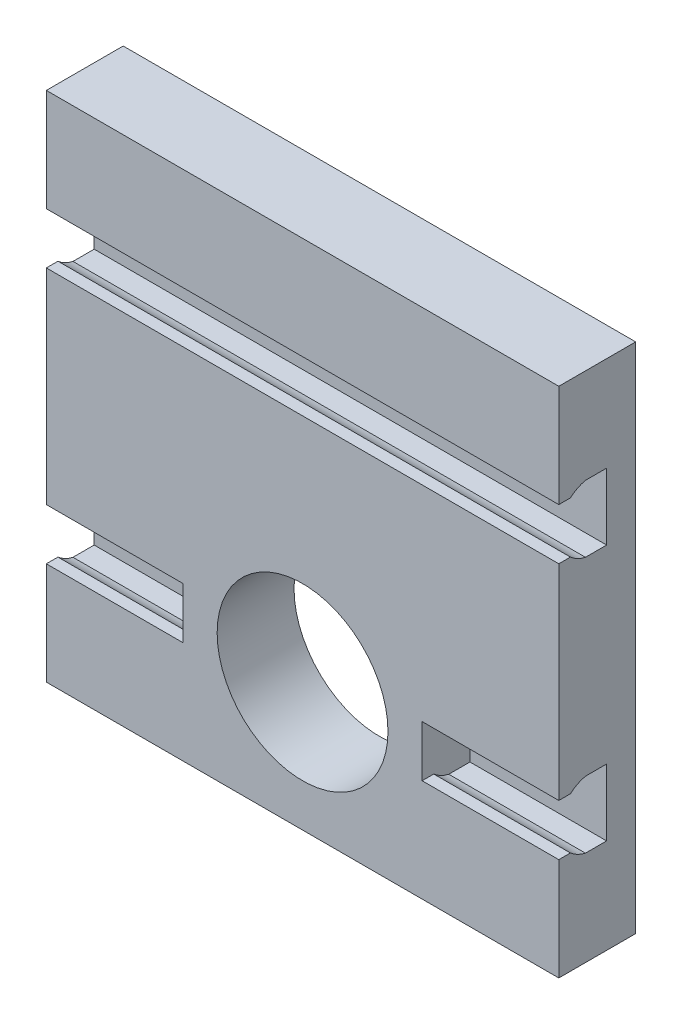
ISO-10303-21;
HEADER;
FILE_DESCRIPTION(('STEP AP214'),'2;1');
FILE_NAME('part.step','',(''),(''),'','','');
FILE_SCHEMA(('AUTOMOTIVE_DESIGN { 1 0 10303 214 1 1 1 1 }'));
ENDSEC;
DATA;
#1=APPLICATION_CONTEXT('core data for automotive mechanical design processes');
#2=APPLICATION_PROTOCOL_DEFINITION('international standard','automotive_design',2000,#1);
#3=PRODUCT_CONTEXT('',#1,'mechanical');
#4=PRODUCT('Part','Part','',(#3));
#5=PRODUCT_RELATED_PRODUCT_CATEGORY('part','',(#4));
#6=PRODUCT_DEFINITION_FORMATION('','',#4);
#7=PRODUCT_DEFINITION_CONTEXT('part definition',#1,'design');
#8=PRODUCT_DEFINITION('design','',#6,#7);
#9=PRODUCT_DEFINITION_SHAPE('','',#8);
#10=(LENGTH_UNIT() NAMED_UNIT(*) SI_UNIT(.MILLI.,.METRE.));
#11=(NAMED_UNIT(*) PLANE_ANGLE_UNIT() SI_UNIT($,.RADIAN.));
#12=(NAMED_UNIT(*) SI_UNIT($,.STERADIAN.) SOLID_ANGLE_UNIT());
#13=UNCERTAINTY_MEASURE_WITH_UNIT(LENGTH_MEASURE(1.E-05),#10,'distance_accuracy_value','');
#14=(GEOMETRIC_REPRESENTATION_CONTEXT(3) GLOBAL_UNCERTAINTY_ASSIGNED_CONTEXT((#13)) GLOBAL_UNIT_ASSIGNED_CONTEXT((#10,
#11,#12)) REPRESENTATION_CONTEXT('',''));
#15=CARTESIAN_POINT('',(0.,0.,0.));
#16=DIRECTION('',(0.,0.,1.));
#17=DIRECTION('',(1.,0.,0.));
#18=AXIS2_PLACEMENT_3D('',#15,#16,#17);
#19=CARTESIAN_POINT('',(0.,0.,4.5));
#20=DIRECTION('',(0.,0.,-1.));
#21=DIRECTION('',(-1.,0.,0.));
#22=AXIS2_PLACEMENT_3D('',#19,#20,#21);
#23=PLANE('',#22);
#24=CARTESIAN_POINT('',(0.,-6.,4.5));
#25=DIRECTION('',(0.,0.,1.));
#26=DIRECTION('',(1.,0.,0.));
#27=AXIS2_PLACEMENT_3D('',#24,#25,#26);
#28=CIRCLE('',#27,5.);
#29=CARTESIAN_POINT('',(5.,-6.,4.5));
#30=VERTEX_POINT('',#29);
#31=EDGE_CURVE('E405',#30,#30,#28,.T.);
#32=ORIENTED_EDGE('',*,*,#31,.F.);
#33=EDGE_LOOP('',(#32));
#34=FACE_BOUND('',#33,.T.);
#35=DIRECTION('',(-1.,0.,0.));
#36=VECTOR('',#35,1.);
#37=CARTESIAN_POINT('',(-7.,-4.5,4.5));
#38=LINE('',#37,#36);
#39=CARTESIAN_POINT('',(-7.,-4.5,4.5));
#40=VERTEX_POINT('',#39);
#41=CARTESIAN_POINT('',(-15.,-4.5,4.5));
#42=VERTEX_POINT('',#41);
#43=EDGE_CURVE('E274',#40,#42,#38,.T.);
#44=ORIENTED_EDGE('',*,*,#43,.F.);
#45=DIRECTION('',(0.,-1.,0.));
#46=VECTOR('',#45,1.);
#47=CARTESIAN_POINT('',(-7.,-7.5,4.5));
#48=LINE('',#47,#46);
#49=CARTESIAN_POINT('',(-7.,-7.5,4.5));
#50=VERTEX_POINT('',#49);
#51=EDGE_CURVE('E254',#40,#50,#48,.T.);
#52=ORIENTED_EDGE('',*,*,#51,.T.);
#53=DIRECTION('',(-1.,0.,0.));
#54=VECTOR('',#53,1.);
#55=CARTESIAN_POINT('',(-7.,-7.5,4.5));
#56=LINE('',#55,#54);
#57=CARTESIAN_POINT('',(-15.,-7.5,4.5));
#58=VERTEX_POINT('',#57);
#59=EDGE_CURVE('E276',#50,#58,#56,.T.);
#60=ORIENTED_EDGE('',*,*,#59,.T.);
#61=DIRECTION('',(0.,-1.,0.));
#62=VECTOR('',#61,1.);
#63=CARTESIAN_POINT('',(-15.,-13.5,4.5));
#64=LINE('',#63,#62);
#65=CARTESIAN_POINT('',(-15.,-13.5,4.5));
#66=VERTEX_POINT('',#65);
#67=EDGE_CURVE('E418',#58,#66,#64,.T.);
#68=ORIENTED_EDGE('',*,*,#67,.T.);
#69=DIRECTION('',(1.,0.,0.));
#70=VECTOR('',#69,1.);
#71=CARTESIAN_POINT('',(-15.,-13.5,4.5));
#72=LINE('',#71,#70);
#73=CARTESIAN_POINT('',(15.,-13.5,4.5));
#74=VERTEX_POINT('',#73);
#75=EDGE_CURVE('E422',#66,#74,#72,.T.);
#76=ORIENTED_EDGE('',*,*,#75,.T.);
#77=DIRECTION('',(0.,1.,0.));
#78=VECTOR('',#77,1.);
#79=CARTESIAN_POINT('',(15.,-13.5,4.5));
#80=LINE('',#79,#78);
#81=CARTESIAN_POINT('',(15.,-7.5,4.5));
#82=VERTEX_POINT('',#81);
#83=EDGE_CURVE('E411',#74,#82,#80,.T.);
#84=ORIENTED_EDGE('',*,*,#83,.T.);
#85=DIRECTION('',(1.,0.,0.));
#86=VECTOR('',#85,1.);
#87=CARTESIAN_POINT('',(7.,-7.5,4.5));
#88=LINE('',#87,#86);
#89=CARTESIAN_POINT('',(7.,-7.5,4.5));
#90=VERTEX_POINT('',#89);
#91=EDGE_CURVE('E340',#90,#82,#88,.T.);
#92=ORIENTED_EDGE('',*,*,#91,.F.);
#93=DIRECTION('',(0.,-1.,0.));
#94=VECTOR('',#93,1.);
#95=CARTESIAN_POINT('',(7.,-7.5,4.5));
#96=LINE('',#95,#94);
#97=CARTESIAN_POINT('',(7.,-4.5,4.5));
#98=VERTEX_POINT('',#97);
#99=EDGE_CURVE('E293',#98,#90,#96,.T.);
#100=ORIENTED_EDGE('',*,*,#99,.F.);
#101=DIRECTION('',(1.,0.,0.));
#102=VECTOR('',#101,1.);
#103=CARTESIAN_POINT('',(7.,-4.5,4.5));
#104=LINE('',#103,#102);
#105=CARTESIAN_POINT('',(15.,-4.5,4.5));
#106=VERTEX_POINT('',#105);
#107=EDGE_CURVE('E342',#98,#106,#104,.T.);
#108=ORIENTED_EDGE('',*,*,#107,.T.);
#109=CARTESIAN_POINT('',(15.,7.5,4.5));
#110=VERTEX_POINT('',#109);
#111=EDGE_CURVE('E415',#106,#110,#80,.T.);
#112=ORIENTED_EDGE('',*,*,#111,.T.);
#113=DIRECTION('',(1.,0.,0.));
#114=VECTOR('',#113,1.);
#115=CARTESIAN_POINT('',(-15.,7.49999999999999,4.5));
#116=LINE('',#115,#114);
#117=CARTESIAN_POINT('',(-15.,7.49999999999999,4.5));
#118=VERTEX_POINT('',#117);
#119=EDGE_CURVE('E368',#118,#110,#116,.T.);
#120=ORIENTED_EDGE('',*,*,#119,.F.);
#121=EDGE_CURVE('E423',#118,#42,#64,.T.);
#122=ORIENTED_EDGE('',*,*,#121,.T.);
#123=EDGE_LOOP('',(#44,#52,#60,#68,#76,#84,#92,#100,#108,#112,#120,#122));
#124=FACE_BOUND('',#123,.T.);
#125=ADVANCED_FACE('F35',(#34,#124),#23,.F.);
#126=CARTESIAN_POINT('',(-15.,-13.5,4.5));
#127=DIRECTION('',(1.,0.,0.));
#128=DIRECTION('',(0.,1.,0.));
#129=AXIS2_PLACEMENT_3D('',#126,#127,#128);
#130=PLANE('',#129);
#131=DIRECTION('',(0.,0.,1.));
#132=VECTOR('',#131,1.);
#133=CARTESIAN_POINT('',(-15.,-4.5,4.5));
#134=LINE('',#133,#132);
#135=CARTESIAN_POINT('',(-15.,-4.5,3.82));
#136=VERTEX_POINT('',#135);
#137=EDGE_CURVE('E241',#136,#42,#134,.T.);
#138=ORIENTED_EDGE('',*,*,#137,.T.);
#139=ORIENTED_EDGE('',*,*,#121,.F.);
#140=DIRECTION('',(0.,0.,-1.));
#141=VECTOR('',#140,1.);
#142=CARTESIAN_POINT('',(-15.,7.49999999999999,4.5));
#143=LINE('',#142,#141);
#144=CARTESIAN_POINT('',(-15.,7.49999999999999,3.82));
#145=VERTEX_POINT('',#144);
#146=EDGE_CURVE('E346',#118,#145,#143,.T.);
#147=ORIENTED_EDGE('',*,*,#146,.T.);
#148=CARTESIAN_POINT('',(-15.,8.99999999999999,2.4971243444677));
#149=DIRECTION('',(1.,0.,0.));
#150=DIRECTION('',(0.,1.,0.));
#151=AXIS2_PLACEMENT_3D('',#148,#149,#150);
#152=CIRCLE('',#151,2.);
#153=CARTESIAN_POINT('',(-15.,7.04999999999999,2.94153406533349));
#154=VERTEX_POINT('',#153);
#155=EDGE_CURVE('E349',#145,#154,#152,.T.);
#156=ORIENTED_EDGE('',*,*,#155,.T.);
#157=DIRECTION('',(0.,0.,-1.));
#158=VECTOR('',#157,1.);
#159=CARTESIAN_POINT('',(-15.,7.05,2.94153406533349));
#160=LINE('',#159,#158);
#161=CARTESIAN_POINT('',(-15.,7.05,1.7));
#162=VERTEX_POINT('',#161);
#163=EDGE_CURVE('E353',#154,#162,#160,.T.);
#164=ORIENTED_EDGE('',*,*,#163,.T.);
#165=DIRECTION('',(0.,1.,0.));
#166=VECTOR('',#165,1.);
#167=CARTESIAN_POINT('',(-15.,10.95,1.7));
#168=LINE('',#167,#166);
#169=CARTESIAN_POINT('',(-15.,10.95,1.7));
#170=VERTEX_POINT('',#169);
#171=EDGE_CURVE('E356',#162,#170,#168,.T.);
#172=ORIENTED_EDGE('',*,*,#171,.T.);
#173=DIRECTION('',(0.,0.,1.));
#174=VECTOR('',#173,1.);
#175=CARTESIAN_POINT('',(-15.,10.95,2.94153406533349));
#176=LINE('',#175,#174);
#177=CARTESIAN_POINT('',(-15.,10.95,2.94153406533349));
#178=VERTEX_POINT('',#177);
#179=EDGE_CURVE('E359',#170,#178,#176,.T.);
#180=ORIENTED_EDGE('',*,*,#179,.T.);
#181=CARTESIAN_POINT('',(-15.,8.99999999999999,2.4971243444677));
#182=DIRECTION('',(1.,0.,0.));
#183=DIRECTION('',(0.,1.,0.));
#184=AXIS2_PLACEMENT_3D('',#181,#182,#183);
#185=CIRCLE('',#184,2.);
#186=CARTESIAN_POINT('',(-15.,10.5,3.82));
#187=VERTEX_POINT('',#186);
#188=EDGE_CURVE('E362',#178,#187,#185,.T.);
#189=ORIENTED_EDGE('',*,*,#188,.T.);
#190=DIRECTION('',(0.,0.,1.));
#191=VECTOR('',#190,1.);
#192=CARTESIAN_POINT('',(-15.,10.5,4.5));
#193=LINE('',#192,#191);
#194=CARTESIAN_POINT('',(-15.,10.5,4.5));
#195=VERTEX_POINT('',#194);
#196=EDGE_CURVE('E365',#187,#195,#193,.T.);
#197=ORIENTED_EDGE('',*,*,#196,.T.);
#198=CARTESIAN_POINT('',(-15.,16.5,4.5));
#199=VERTEX_POINT('',#198);
#200=EDGE_CURVE('E419',#199,#195,#64,.T.);
#201=ORIENTED_EDGE('',*,*,#200,.F.);
#202=DIRECTION('',(0.,0.,-1.));
#203=VECTOR('',#202,1.);
#204=CARTESIAN_POINT('',(-15.,16.5,4.5));
#205=LINE('',#204,#203);
#206=CARTESIAN_POINT('',(-15.,16.5,0.));
#207=VERTEX_POINT('',#206);
#208=EDGE_CURVE('E43',#199,#207,#205,.T.);
#209=ORIENTED_EDGE('',*,*,#208,.T.);
#210=DIRECTION('',(0.,-1.,0.));
#211=VECTOR('',#210,1.);
#212=CARTESIAN_POINT('',(-15.,-13.5,0.));
#213=LINE('',#212,#211);
#214=CARTESIAN_POINT('',(-15.,-13.5,0.));
#215=VERTEX_POINT('',#214);
#216=EDGE_CURVE('E430',#207,#215,#213,.T.);
#217=ORIENTED_EDGE('',*,*,#216,.T.);
#218=DIRECTION('',(0.,0.,-1.));
#219=VECTOR('',#218,1.);
#220=CARTESIAN_POINT('',(-15.,-13.5,4.5));
#221=LINE('',#220,#219);
#222=EDGE_CURVE('E436',#66,#215,#221,.T.);
#223=ORIENTED_EDGE('',*,*,#222,.F.);
#224=ORIENTED_EDGE('',*,*,#67,.F.);
#225=DIRECTION('',(0.,0.,-1.));
#226=VECTOR('',#225,1.);
#227=CARTESIAN_POINT('',(-15.,-7.5,3.82));
#228=LINE('',#227,#226);
#229=CARTESIAN_POINT('',(-15.,-7.5,3.82));
#230=VERTEX_POINT('',#229);
#231=EDGE_CURVE('E244',#58,#230,#228,.T.);
#232=ORIENTED_EDGE('',*,*,#231,.T.);
#233=CARTESIAN_POINT('',(-15.,-6.,2.4971243444677));
#234=DIRECTION('',(1.,0.,0.));
#235=DIRECTION('',(0.,-1.,0.));
#236=AXIS2_PLACEMENT_3D('',#233,#234,#235);
#237=CIRCLE('',#236,2.);
#238=CARTESIAN_POINT('',(-15.,-7.95,2.94153406533349));
#239=VERTEX_POINT('',#238);
#240=EDGE_CURVE('E267',#230,#239,#237,.T.);
#241=ORIENTED_EDGE('',*,*,#240,.T.);
#242=DIRECTION('',(0.,0.,-1.));
#243=VECTOR('',#242,1.);
#244=CARTESIAN_POINT('',(-15.,-7.95,1.7));
#245=LINE('',#244,#243);
#246=CARTESIAN_POINT('',(-15.,-7.95,1.7));
#247=VERTEX_POINT('',#246);
#248=EDGE_CURVE('E264',#239,#247,#245,.T.);
#249=ORIENTED_EDGE('',*,*,#248,.T.);
#250=DIRECTION('',(0.,1.,0.));
#251=VECTOR('',#250,1.);
#252=CARTESIAN_POINT('',(-15.,-4.05000000000001,1.7));
#253=LINE('',#252,#251);
#254=CARTESIAN_POINT('',(-15.,-4.05000000000001,1.7));
#255=VERTEX_POINT('',#254);
#256=EDGE_CURVE('E261',#247,#255,#253,.T.);
#257=ORIENTED_EDGE('',*,*,#256,.T.);
#258=DIRECTION('',(0.,0.,1.));
#259=VECTOR('',#258,1.);
#260=CARTESIAN_POINT('',(-15.,-4.05,2.94153406533349));
#261=LINE('',#260,#259);
#262=CARTESIAN_POINT('',(-15.,-4.05,2.94153406533349));
#263=VERTEX_POINT('',#262);
#264=EDGE_CURVE('E259',#255,#263,#261,.T.);
#265=ORIENTED_EDGE('',*,*,#264,.T.);
#266=CARTESIAN_POINT('',(-15.,-6.,2.4971243444677));
#267=DIRECTION('',(1.,0.,0.));
#268=DIRECTION('',(0.,-1.,0.));
#269=AXIS2_PLACEMENT_3D('',#266,#267,#268);
#270=CIRCLE('',#269,2.);
#271=EDGE_CURVE('E50',#263,#136,#270,.T.);
#272=ORIENTED_EDGE('',*,*,#271,.T.);
#273=EDGE_LOOP('',(#138,#139,#147,#156,#164,#172,#180,#189,#197,#201,#209,#217,#223,#224,#232,
#241,#249,#257,#265,#272));
#274=FACE_BOUND('',#273,.T.);
#275=ADVANCED_FACE('F443',(#274),#130,.F.);
#276=ORIENTED_EDGE('',*,*,#200,.T.);
#277=DIRECTION('',(1.,0.,0.));
#278=VECTOR('',#277,1.);
#279=CARTESIAN_POINT('',(-15.,10.5,4.5));
#280=LINE('',#279,#278);
#281=CARTESIAN_POINT('',(15.,10.5,4.5));
#282=VERTEX_POINT('',#281);
#283=EDGE_CURVE('E387',#195,#282,#280,.T.);
#284=ORIENTED_EDGE('',*,*,#283,.T.);
#285=CARTESIAN_POINT('',(15.,16.5,4.5));
#286=VERTEX_POINT('',#285);
#287=EDGE_CURVE('E416',#282,#286,#80,.T.);
#288=ORIENTED_EDGE('',*,*,#287,.T.);
#289=DIRECTION('',(-1.,0.,0.));
#290=VECTOR('',#289,1.);
#291=CARTESIAN_POINT('',(-15.,16.5,4.5));
#292=LINE('',#291,#290);
#293=EDGE_CURVE('E414',#286,#199,#292,.T.);
#294=ORIENTED_EDGE('',*,*,#293,.T.);
#295=EDGE_LOOP('',(#276,#284,#288,#294));
#296=FACE_BOUND('',#295,.T.);
#297=ADVANCED_FACE('F499',(#296),#23,.F.);
#298=CARTESIAN_POINT('',(0.,0.,0.));
#299=DIRECTION('',(0.,0.,-1.));
#300=DIRECTION('',(-1.,0.,0.));
#301=AXIS2_PLACEMENT_3D('',#298,#299,#300);
#302=PLANE('',#301);
#303=DIRECTION('',(0.,1.,0.));
#304=VECTOR('',#303,1.);
#305=CARTESIAN_POINT('',(15.,-13.5,0.));
#306=LINE('',#305,#304);
#307=CARTESIAN_POINT('',(15.,-13.5,0.));
#308=VERTEX_POINT('',#307);
#309=CARTESIAN_POINT('',(15.,16.5,0.));
#310=VERTEX_POINT('',#309);
#311=EDGE_CURVE('E408',#308,#310,#306,.T.);
#312=ORIENTED_EDGE('',*,*,#311,.F.);
#313=DIRECTION('',(1.,0.,0.));
#314=VECTOR('',#313,1.);
#315=CARTESIAN_POINT('',(-15.,-13.5,0.));
#316=LINE('',#315,#314);
#317=EDGE_CURVE('E432',#215,#308,#316,.T.);
#318=ORIENTED_EDGE('',*,*,#317,.F.);
#319=ORIENTED_EDGE('',*,*,#216,.F.);
#320=DIRECTION('',(-1.,0.,0.));
#321=VECTOR('',#320,1.);
#322=CARTESIAN_POINT('',(-15.,16.5,0.));
#323=LINE('',#322,#321);
#324=EDGE_CURVE('E428',#310,#207,#323,.T.);
#325=ORIENTED_EDGE('',*,*,#324,.F.);
#326=EDGE_LOOP('',(#312,#318,#319,#325));
#327=FACE_BOUND('',#326,.T.);
#328=CARTESIAN_POINT('',(0.,-6.,0.));
#329=DIRECTION('',(0.,0.,1.));
#330=DIRECTION('',(1.,0.,0.));
#331=AXIS2_PLACEMENT_3D('',#328,#329,#330);
#332=CIRCLE('',#331,5.);
#333=CARTESIAN_POINT('',(5.,-6.,0.));
#334=VERTEX_POINT('',#333);
#335=EDGE_CURVE('E390',#334,#334,#332,.T.);
#336=ORIENTED_EDGE('',*,*,#335,.T.);
#337=EDGE_LOOP('',(#336));
#338=FACE_BOUND('',#337,.T.);
#339=ADVANCED_FACE('F450',(#327,#338),#302,.T.);
#340=CARTESIAN_POINT('',(15.,-13.5,4.5));
#341=DIRECTION('',(-1.,0.,0.));
#342=DIRECTION('',(0.,-1.,0.));
#343=AXIS2_PLACEMENT_3D('',#340,#341,#342);
#344=PLANE('',#343);
#345=CARTESIAN_POINT('',(15.,-6.,2.4971243444677));
#346=DIRECTION('',(1.,0.,0.));
#347=DIRECTION('',(0.,-1.,0.));
#348=AXIS2_PLACEMENT_3D('',#345,#346,#347);
#349=CIRCLE('',#348,2.);
#350=CARTESIAN_POINT('',(15.,-7.5,3.82));
#351=VERTEX_POINT('',#350);
#352=CARTESIAN_POINT('',(15.,-7.95,2.94153406533349));
#353=VERTEX_POINT('',#352);
#354=EDGE_CURVE('E318',#351,#353,#349,.T.);
#355=ORIENTED_EDGE('',*,*,#354,.F.);
#356=DIRECTION('',(0.,0.,-1.));
#357=VECTOR('',#356,1.);
#358=CARTESIAN_POINT('',(15.,-7.5,3.82));
#359=LINE('',#358,#357);
#360=EDGE_CURVE('E315',#82,#351,#359,.T.);
#361=ORIENTED_EDGE('',*,*,#360,.F.);
#362=ORIENTED_EDGE('',*,*,#83,.F.);
#363=DIRECTION('',(0.,0.,-1.));
#364=VECTOR('',#363,1.);
#365=CARTESIAN_POINT('',(15.,-13.5,4.5));
#366=LINE('',#365,#364);
#367=EDGE_CURVE('E425',#74,#308,#366,.T.);
#368=ORIENTED_EDGE('',*,*,#367,.T.);
#369=ORIENTED_EDGE('',*,*,#311,.T.);
#370=DIRECTION('',(0.,0.,-1.));
#371=VECTOR('',#370,1.);
#372=CARTESIAN_POINT('',(15.,16.5,4.5));
#373=LINE('',#372,#371);
#374=EDGE_CURVE('E11',#286,#310,#373,.T.);
#375=ORIENTED_EDGE('',*,*,#374,.F.);
#376=ORIENTED_EDGE('',*,*,#287,.F.);
#377=DIRECTION('',(0.,0.,1.));
#378=VECTOR('',#377,1.);
#379=CARTESIAN_POINT('',(15.,10.5,4.5));
#380=LINE('',#379,#378);
#381=CARTESIAN_POINT('',(15.,10.5,3.82));
#382=VERTEX_POINT('',#381);
#383=EDGE_CURVE('E350',#382,#282,#380,.T.);
#384=ORIENTED_EDGE('',*,*,#383,.F.);
#385=CARTESIAN_POINT('',(15.,9.,2.4971243444677));
#386=DIRECTION('',(1.,0.,0.));
#387=DIRECTION('',(0.,1.,0.));
#388=AXIS2_PLACEMENT_3D('',#385,#386,#387);
#389=CIRCLE('',#388,2.);
#390=CARTESIAN_POINT('',(15.,10.95,2.94153406533349));
#391=VERTEX_POINT('',#390);
#392=EDGE_CURVE('E383',#391,#382,#389,.T.);
#393=ORIENTED_EDGE('',*,*,#392,.F.);
#394=DIRECTION('',(0.,0.,1.));
#395=VECTOR('',#394,1.);
#396=CARTESIAN_POINT('',(15.,10.95,2.94153406533349));
#397=LINE('',#396,#395);
#398=CARTESIAN_POINT('',(15.,10.95,1.7));
#399=VERTEX_POINT('',#398);
#400=EDGE_CURVE('E380',#399,#391,#397,.T.);
#401=ORIENTED_EDGE('',*,*,#400,.F.);
#402=DIRECTION('',(0.,1.,0.));
#403=VECTOR('',#402,1.);
#404=CARTESIAN_POINT('',(15.,10.95,1.7));
#405=LINE('',#404,#403);
#406=CARTESIAN_POINT('',(15.,7.05,1.7));
#407=VERTEX_POINT('',#406);
#408=EDGE_CURVE('E377',#407,#399,#405,.T.);
#409=ORIENTED_EDGE('',*,*,#408,.F.);
#410=DIRECTION('',(0.,0.,-1.));
#411=VECTOR('',#410,1.);
#412=CARTESIAN_POINT('',(15.,7.05,2.94153406533349));
#413=LINE('',#412,#411);
#414=CARTESIAN_POINT('',(15.,7.05,2.94153406533349));
#415=VERTEX_POINT('',#414);
#416=EDGE_CURVE('E374',#415,#407,#413,.T.);
#417=ORIENTED_EDGE('',*,*,#416,.F.);
#418=CARTESIAN_POINT('',(15.,9.,2.4971243444677));
#419=DIRECTION('',(1.,0.,0.));
#420=DIRECTION('',(0.,1.,0.));
#421=AXIS2_PLACEMENT_3D('',#418,#419,#420);
#422=CIRCLE('',#421,2.);
#423=CARTESIAN_POINT('',(15.,7.5,3.82));
#424=VERTEX_POINT('',#423);
#425=EDGE_CURVE('E371',#424,#415,#422,.T.);
#426=ORIENTED_EDGE('',*,*,#425,.F.);
#427=DIRECTION('',(0.,0.,-1.));
#428=VECTOR('',#427,1.);
#429=CARTESIAN_POINT('',(15.,7.5,4.5));
#430=LINE('',#429,#428);
#431=EDGE_CURVE('E331',#110,#424,#430,.T.);
#432=ORIENTED_EDGE('',*,*,#431,.F.);
#433=ORIENTED_EDGE('',*,*,#111,.F.);
#434=DIRECTION('',(0.,0.,1.));
#435=VECTOR('',#434,1.);
#436=CARTESIAN_POINT('',(15.,-4.5,4.5));
#437=LINE('',#436,#435);
#438=CARTESIAN_POINT('',(15.,-4.5,3.82));
#439=VERTEX_POINT('',#438);
#440=EDGE_CURVE('E313',#439,#106,#437,.T.);
#441=ORIENTED_EDGE('',*,*,#440,.F.);
#442=CARTESIAN_POINT('',(15.,-6.,2.4971243444677));
#443=DIRECTION('',(1.,0.,0.));
#444=DIRECTION('',(0.,-1.,0.));
#445=AXIS2_PLACEMENT_3D('',#442,#443,#444);
#446=CIRCLE('',#445,2.);
#447=CARTESIAN_POINT('',(15.,-4.05,2.94153406533349));
#448=VERTEX_POINT('',#447);
#449=EDGE_CURVE('E58',#448,#439,#446,.T.);
#450=ORIENTED_EDGE('',*,*,#449,.F.);
#451=DIRECTION('',(0.,0.,1.));
#452=VECTOR('',#451,1.);
#453=CARTESIAN_POINT('',(15.,-4.05,2.94153406533349));
#454=LINE('',#453,#452);
#455=CARTESIAN_POINT('',(15.,-4.05,1.7));
#456=VERTEX_POINT('',#455);
#457=EDGE_CURVE('E290',#456,#448,#454,.T.);
#458=ORIENTED_EDGE('',*,*,#457,.F.);
#459=DIRECTION('',(0.,1.,0.));
#460=VECTOR('',#459,1.);
#461=CARTESIAN_POINT('',(15.,-4.05,1.7));
#462=LINE('',#461,#460);
#463=CARTESIAN_POINT('',(15.,-7.95,1.7));
#464=VERTEX_POINT('',#463);
#465=EDGE_CURVE('E324',#464,#456,#462,.T.);
#466=ORIENTED_EDGE('',*,*,#465,.F.);
#467=DIRECTION('',(0.,0.,-1.));
#468=VECTOR('',#467,1.);
#469=CARTESIAN_POINT('',(15.,-7.95,1.7));
#470=LINE('',#469,#468);
#471=EDGE_CURVE('E321',#353,#464,#470,.T.);
#472=ORIENTED_EDGE('',*,*,#471,.F.);
#473=EDGE_LOOP('',(#355,#361,#362,#368,#369,#375,#376,#384,#393,#401,#409,#417,#426,#432,#433,
#441,#450,#458,#466,#472));
#474=FACE_BOUND('',#473,.T.);
#475=ADVANCED_FACE('F37',(#474),#344,.F.);
#476=CARTESIAN_POINT('',(-15.,16.5,4.5));
#477=DIRECTION('',(0.,-1.,0.));
#478=DIRECTION('',(0.,0.,-1.));
#479=AXIS2_PLACEMENT_3D('',#476,#477,#478);
#480=PLANE('',#479);
#481=ORIENTED_EDGE('',*,*,#324,.T.);
#482=ORIENTED_EDGE('',*,*,#208,.F.);
#483=ORIENTED_EDGE('',*,*,#293,.F.);
#484=ORIENTED_EDGE('',*,*,#374,.T.);
#485=EDGE_LOOP('',(#481,#482,#483,#484));
#486=FACE_BOUND('',#485,.T.);
#487=ADVANCED_FACE('F513',(#486),#480,.F.);
#488=CARTESIAN_POINT('',(-15.,-13.5,4.5));
#489=DIRECTION('',(0.,1.,0.));
#490=DIRECTION('',(-1.,0.,0.));
#491=AXIS2_PLACEMENT_3D('',#488,#489,#490);
#492=PLANE('',#491);
#493=ORIENTED_EDGE('',*,*,#317,.T.);
#494=ORIENTED_EDGE('',*,*,#367,.F.);
#495=ORIENTED_EDGE('',*,*,#75,.F.);
#496=ORIENTED_EDGE('',*,*,#222,.T.);
#497=EDGE_LOOP('',(#493,#494,#495,#496));
#498=FACE_BOUND('',#497,.T.);
#499=ADVANCED_FACE('F454',(#498),#492,.F.);
#500=CARTESIAN_POINT('',(0.,-6.,4.5));
#501=DIRECTION('',(0.,0.,-1.));
#502=DIRECTION('',(-1.,0.,0.));
#503=AXIS2_PLACEMENT_3D('',#500,#501,#502);
#504=CYLINDRICAL_SURFACE('',#503,5.);
#505=ORIENTED_EDGE('',*,*,#31,.T.);
#506=EDGE_LOOP('',(#505));
#507=FACE_BOUND('',#506,.T.);
#508=ORIENTED_EDGE('',*,*,#335,.F.);
#509=EDGE_LOOP('',(#508));
#510=FACE_BOUND('',#509,.T.);
#511=ADVANCED_FACE('F544',(#507,#510),#504,.F.);
#512=CARTESIAN_POINT('',(-15.,10.5,4.5));
#513=DIRECTION('',(0.,1.,0.));
#514=DIRECTION('',(-1.,0.,0.));
#515=AXIS2_PLACEMENT_3D('',#512,#513,#514);
#516=PLANE('',#515);
#517=ORIENTED_EDGE('',*,*,#383,.T.);
#518=ORIENTED_EDGE('',*,*,#283,.F.);
#519=ORIENTED_EDGE('',*,*,#196,.F.);
#520=DIRECTION('',(1.,0.,0.));
#521=VECTOR('',#520,1.);
#522=CARTESIAN_POINT('',(-15.,10.5,3.82));
#523=LINE('',#522,#521);
#524=EDGE_CURVE('E391',#187,#382,#523,.T.);
#525=ORIENTED_EDGE('',*,*,#524,.T.);
#526=EDGE_LOOP('',(#517,#518,#519,#525));
#527=FACE_BOUND('',#526,.T.);
#528=ADVANCED_FACE('F542',(#527),#516,.F.);
#529=CARTESIAN_POINT('',(-15.,8.99999999999999,2.4971243444677));
#530=DIRECTION('',(1.,0.,0.));
#531=DIRECTION('',(0.,1.,0.));
#532=AXIS2_PLACEMENT_3D('',#529,#530,#531);
#533=CYLINDRICAL_SURFACE('',#532,2.);
#534=ORIENTED_EDGE('',*,*,#392,.T.);
#535=ORIENTED_EDGE('',*,*,#524,.F.);
#536=ORIENTED_EDGE('',*,*,#188,.F.);
#537=DIRECTION('',(1.,0.,0.));
#538=VECTOR('',#537,1.);
#539=CARTESIAN_POINT('',(-15.,10.95,2.94153406533349));
#540=LINE('',#539,#538);
#541=EDGE_CURVE('E393',#178,#391,#540,.T.);
#542=ORIENTED_EDGE('',*,*,#541,.T.);
#543=EDGE_LOOP('',(#534,#535,#536,#542));
#544=FACE_BOUND('',#543,.T.);
#545=ADVANCED_FACE('F540',(#544),#533,.F.);
#546=CARTESIAN_POINT('',(-15.,10.95,2.94153406533349));
#547=DIRECTION('',(0.,1.,0.));
#548=DIRECTION('',(-1.,0.,0.));
#549=AXIS2_PLACEMENT_3D('',#546,#547,#548);
#550=PLANE('',#549);
#551=ORIENTED_EDGE('',*,*,#400,.T.);
#552=ORIENTED_EDGE('',*,*,#541,.F.);
#553=ORIENTED_EDGE('',*,*,#179,.F.);
#554=DIRECTION('',(1.,0.,0.));
#555=VECTOR('',#554,1.);
#556=CARTESIAN_POINT('',(-15.,10.95,1.7));
#557=LINE('',#556,#555);
#558=EDGE_CURVE('E395',#170,#399,#557,.T.);
#559=ORIENTED_EDGE('',*,*,#558,.T.);
#560=EDGE_LOOP('',(#551,#552,#553,#559));
#561=FACE_BOUND('',#560,.T.);
#562=ADVANCED_FACE('F536',(#561),#550,.F.);
#563=CARTESIAN_POINT('',(-15.,10.95,1.7));
#564=DIRECTION('',(0.,0.,-1.));
#565=DIRECTION('',(0.,1.,0.));
#566=AXIS2_PLACEMENT_3D('',#563,#564,#565);
#567=PLANE('',#566);
#568=ORIENTED_EDGE('',*,*,#408,.T.);
#569=ORIENTED_EDGE('',*,*,#558,.F.);
#570=ORIENTED_EDGE('',*,*,#171,.F.);
#571=DIRECTION('',(1.,0.,0.));
#572=VECTOR('',#571,1.);
#573=CARTESIAN_POINT('',(-15.,7.05,1.7));
#574=LINE('',#573,#572);
#575=EDGE_CURVE('E397',#162,#407,#574,.T.);
#576=ORIENTED_EDGE('',*,*,#575,.T.);
#577=EDGE_LOOP('',(#568,#569,#570,#576));
#578=FACE_BOUND('',#577,.T.);
#579=ADVANCED_FACE('F532',(#578),#567,.F.);
#580=CARTESIAN_POINT('',(-15.,7.05,2.94153406533349));
#581=DIRECTION('',(0.,-1.,0.));
#582=DIRECTION('',(1.,0.,0.));
#583=AXIS2_PLACEMENT_3D('',#580,#581,#582);
#584=PLANE('',#583);
#585=ORIENTED_EDGE('',*,*,#416,.T.);
#586=ORIENTED_EDGE('',*,*,#575,.F.);
#587=ORIENTED_EDGE('',*,*,#163,.F.);
#588=DIRECTION('',(1.,0.,0.));
#589=VECTOR('',#588,1.);
#590=CARTESIAN_POINT('',(-15.,7.04999999999999,2.94153406533349));
#591=LINE('',#590,#589);
#592=EDGE_CURVE('E399',#154,#415,#591,.T.);
#593=ORIENTED_EDGE('',*,*,#592,.T.);
#594=EDGE_LOOP('',(#585,#586,#587,#593));
#595=FACE_BOUND('',#594,.T.);
#596=ADVANCED_FACE('F530',(#595),#584,.F.);
#597=CARTESIAN_POINT('',(-15.,8.99999999999999,2.4971243444677));
#598=DIRECTION('',(1.,0.,0.));
#599=DIRECTION('',(0.,1.,0.));
#600=AXIS2_PLACEMENT_3D('',#597,#598,#599);
#601=CYLINDRICAL_SURFACE('',#600,2.);
#602=ORIENTED_EDGE('',*,*,#425,.T.);
#603=ORIENTED_EDGE('',*,*,#592,.F.);
#604=ORIENTED_EDGE('',*,*,#155,.F.);
#605=DIRECTION('',(1.,0.,0.));
#606=VECTOR('',#605,1.);
#607=CARTESIAN_POINT('',(-15.,7.49999999999999,3.82));
#608=LINE('',#607,#606);
#609=EDGE_CURVE('E401',#145,#424,#608,.T.);
#610=ORIENTED_EDGE('',*,*,#609,.T.);
#611=EDGE_LOOP('',(#602,#603,#604,#610));
#612=FACE_BOUND('',#611,.T.);
#613=ADVANCED_FACE('F526',(#612),#601,.F.);
#614=CARTESIAN_POINT('',(-15.,7.49999999999999,4.5));
#615=DIRECTION('',(0.,-1.,0.));
#616=DIRECTION('',(1.,0.,0.));
#617=AXIS2_PLACEMENT_3D('',#614,#615,#616);
#618=PLANE('',#617);
#619=ORIENTED_EDGE('',*,*,#431,.T.);
#620=ORIENTED_EDGE('',*,*,#609,.F.);
#621=ORIENTED_EDGE('',*,*,#146,.F.);
#622=ORIENTED_EDGE('',*,*,#119,.T.);
#623=EDGE_LOOP('',(#619,#620,#621,#622));
#624=FACE_BOUND('',#623,.T.);
#625=ADVANCED_FACE('F520',(#624),#618,.F.);
#626=CARTESIAN_POINT('',(7.,-6.,2.4971243444677));
#627=DIRECTION('',(1.,0.,0.));
#628=DIRECTION('',(0.,1.,0.));
#629=AXIS2_PLACEMENT_3D('',#626,#627,#628);
#630=CYLINDRICAL_SURFACE('',#629,2.);
#631=ORIENTED_EDGE('',*,*,#449,.T.);
#632=DIRECTION('',(1.,0.,0.));
#633=VECTOR('',#632,1.);
#634=CARTESIAN_POINT('',(7.,-4.5,3.82));
#635=LINE('',#634,#633);
#636=CARTESIAN_POINT('',(7.,-4.5,3.82));
#637=VERTEX_POINT('',#636);
#638=EDGE_CURVE('E311',#637,#439,#635,.T.);
#639=ORIENTED_EDGE('',*,*,#638,.F.);
#640=CARTESIAN_POINT('',(7.,-6.,2.4971243444677));
#641=DIRECTION('',(1.,0.,0.));
#642=DIRECTION('',(0.,-1.,0.));
#643=AXIS2_PLACEMENT_3D('',#640,#641,#642);
#644=CIRCLE('',#643,2.);
#645=CARTESIAN_POINT('',(7.,-4.05,2.94153406533349));
#646=VERTEX_POINT('',#645);
#647=EDGE_CURVE('E286',#646,#637,#644,.T.);
#648=ORIENTED_EDGE('',*,*,#647,.F.);
#649=DIRECTION('',(1.,0.,0.));
#650=VECTOR('',#649,1.);
#651=CARTESIAN_POINT('',(7.,-4.05,2.94153406533349));
#652=LINE('',#651,#650);
#653=EDGE_CURVE('E329',#646,#448,#652,.T.);
#654=ORIENTED_EDGE('',*,*,#653,.T.);
#655=EDGE_LOOP('',(#631,#639,#648,#654));
#656=FACE_BOUND('',#655,.T.);
#657=ADVANCED_FACE('F553',(#656),#630,.F.);
#658=CARTESIAN_POINT('',(7.,-4.05,2.94153406533349));
#659=DIRECTION('',(0.,1.,0.));
#660=DIRECTION('',(0.,0.,1.));
#661=AXIS2_PLACEMENT_3D('',#658,#659,#660);
#662=PLANE('',#661);
#663=ORIENTED_EDGE('',*,*,#457,.T.);
#664=ORIENTED_EDGE('',*,*,#653,.F.);
#665=DIRECTION('',(0.,0.,1.));
#666=VECTOR('',#665,1.);
#667=CARTESIAN_POINT('',(7.,-4.05,2.94153406533349));
#668=LINE('',#667,#666);
#669=CARTESIAN_POINT('',(7.,-4.05,1.7));
#670=VERTEX_POINT('',#669);
#671=EDGE_CURVE('E308',#670,#646,#668,.T.);
#672=ORIENTED_EDGE('',*,*,#671,.F.);
#673=DIRECTION('',(1.,0.,0.));
#674=VECTOR('',#673,1.);
#675=CARTESIAN_POINT('',(7.,-4.05,1.7));
#676=LINE('',#675,#674);
#677=EDGE_CURVE('E332',#670,#456,#676,.T.);
#678=ORIENTED_EDGE('',*,*,#677,.T.);
#679=EDGE_LOOP('',(#663,#664,#672,#678));
#680=FACE_BOUND('',#679,.T.);
#681=ADVANCED_FACE('F568',(#680),#662,.F.);
#682=CARTESIAN_POINT('',(7.,-4.05,1.7));
#683=DIRECTION('',(0.,0.,-1.));
#684=DIRECTION('',(0.,1.,0.));
#685=AXIS2_PLACEMENT_3D('',#682,#683,#684);
#686=PLANE('',#685);
#687=ORIENTED_EDGE('',*,*,#465,.T.);
#688=ORIENTED_EDGE('',*,*,#677,.F.);
#689=DIRECTION('',(0.,1.,0.));
#690=VECTOR('',#689,1.);
#691=CARTESIAN_POINT('',(7.,-4.05,1.7));
#692=LINE('',#691,#690);
#693=CARTESIAN_POINT('',(7.,-7.95,1.7));
#694=VERTEX_POINT('',#693);
#695=EDGE_CURVE('E305',#694,#670,#692,.T.);
#696=ORIENTED_EDGE('',*,*,#695,.F.);
#697=DIRECTION('',(1.,0.,0.));
#698=VECTOR('',#697,1.);
#699=CARTESIAN_POINT('',(7.,-7.95,1.7));
#700=LINE('',#699,#698);
#701=EDGE_CURVE('E334',#694,#464,#700,.T.);
#702=ORIENTED_EDGE('',*,*,#701,.T.);
#703=EDGE_LOOP('',(#687,#688,#696,#702));
#704=FACE_BOUND('',#703,.T.);
#705=ADVANCED_FACE('F572',(#704),#686,.F.);
#706=CARTESIAN_POINT('',(7.,-7.95,1.7));
#707=DIRECTION('',(0.,-1.,0.));
#708=DIRECTION('',(1.,0.,0.));
#709=AXIS2_PLACEMENT_3D('',#706,#707,#708);
#710=PLANE('',#709);
#711=ORIENTED_EDGE('',*,*,#471,.T.);
#712=ORIENTED_EDGE('',*,*,#701,.F.);
#713=DIRECTION('',(0.,0.,-1.));
#714=VECTOR('',#713,1.);
#715=CARTESIAN_POINT('',(7.,-7.95,1.7));
#716=LINE('',#715,#714);
#717=CARTESIAN_POINT('',(7.,-7.95,2.94153406533349));
#718=VERTEX_POINT('',#717);
#719=EDGE_CURVE('E302',#718,#694,#716,.T.);
#720=ORIENTED_EDGE('',*,*,#719,.F.);
#721=DIRECTION('',(1.,0.,0.));
#722=VECTOR('',#721,1.);
#723=CARTESIAN_POINT('',(7.,-7.95,2.94153406533349));
#724=LINE('',#723,#722);
#725=EDGE_CURVE('E336',#718,#353,#724,.T.);
#726=ORIENTED_EDGE('',*,*,#725,.T.);
#727=EDGE_LOOP('',(#711,#712,#720,#726));
#728=FACE_BOUND('',#727,.T.);
#729=ADVANCED_FACE('F578',(#728),#710,.F.);
#730=CARTESIAN_POINT('',(7.,-6.,2.4971243444677));
#731=DIRECTION('',(1.,0.,0.));
#732=DIRECTION('',(0.,1.,0.));
#733=AXIS2_PLACEMENT_3D('',#730,#731,#732);
#734=CYLINDRICAL_SURFACE('',#733,2.);
#735=ORIENTED_EDGE('',*,*,#354,.T.);
#736=ORIENTED_EDGE('',*,*,#725,.F.);
#737=CARTESIAN_POINT('',(7.,-6.,2.4971243444677));
#738=DIRECTION('',(1.,0.,0.));
#739=DIRECTION('',(0.,-1.,0.));
#740=AXIS2_PLACEMENT_3D('',#737,#738,#739);
#741=CIRCLE('',#740,2.);
#742=CARTESIAN_POINT('',(7.,-7.5,3.82));
#743=VERTEX_POINT('',#742);
#744=EDGE_CURVE('E299',#743,#718,#741,.T.);
#745=ORIENTED_EDGE('',*,*,#744,.F.);
#746=DIRECTION('',(1.,0.,0.));
#747=VECTOR('',#746,1.);
#748=CARTESIAN_POINT('',(7.,-7.5,3.82));
#749=LINE('',#748,#747);
#750=EDGE_CURVE('E338',#743,#351,#749,.T.);
#751=ORIENTED_EDGE('',*,*,#750,.T.);
#752=EDGE_LOOP('',(#735,#736,#745,#751));
#753=FACE_BOUND('',#752,.T.);
#754=ADVANCED_FACE('F587',(#753),#734,.F.);
#755=CARTESIAN_POINT('',(7.,-7.5,3.82));
#756=DIRECTION('',(0.,-1.,0.));
#757=DIRECTION('',(0.,0.,-1.));
#758=AXIS2_PLACEMENT_3D('',#755,#756,#757);
#759=PLANE('',#758);
#760=ORIENTED_EDGE('',*,*,#360,.T.);
#761=ORIENTED_EDGE('',*,*,#750,.F.);
#762=DIRECTION('',(0.,0.,-1.));
#763=VECTOR('',#762,1.);
#764=CARTESIAN_POINT('',(7.,-7.5,3.82));
#765=LINE('',#764,#763);
#766=EDGE_CURVE('E296',#90,#743,#765,.T.);
#767=ORIENTED_EDGE('',*,*,#766,.F.);
#768=ORIENTED_EDGE('',*,*,#91,.T.);
#769=EDGE_LOOP('',(#760,#761,#767,#768));
#770=FACE_BOUND('',#769,.T.);
#771=ADVANCED_FACE('F591',(#770),#759,.F.);
#772=CARTESIAN_POINT('',(7.,-4.5,4.5));
#773=DIRECTION('',(0.,1.,0.));
#774=DIRECTION('',(-1.,0.,0.));
#775=AXIS2_PLACEMENT_3D('',#772,#773,#774);
#776=PLANE('',#775);
#777=ORIENTED_EDGE('',*,*,#440,.T.);
#778=ORIENTED_EDGE('',*,*,#107,.F.);
#779=DIRECTION('',(0.,0.,1.));
#780=VECTOR('',#779,1.);
#781=CARTESIAN_POINT('',(7.,-4.5,4.5));
#782=LINE('',#781,#780);
#783=EDGE_CURVE('E289',#637,#98,#782,.T.);
#784=ORIENTED_EDGE('',*,*,#783,.F.);
#785=ORIENTED_EDGE('',*,*,#638,.T.);
#786=EDGE_LOOP('',(#777,#778,#784,#785));
#787=FACE_BOUND('',#786,.T.);
#788=ADVANCED_FACE('F594',(#787),#776,.F.);
#789=CARTESIAN_POINT('',(7.,-6.,2.4971243444677));
#790=DIRECTION('',(-1.,0.,0.));
#791=DIRECTION('',(0.,-1.,0.));
#792=AXIS2_PLACEMENT_3D('',#789,#790,#791);
#793=PLANE('',#792);
#794=ORIENTED_EDGE('',*,*,#647,.T.);
#795=ORIENTED_EDGE('',*,*,#783,.T.);
#796=ORIENTED_EDGE('',*,*,#99,.T.);
#797=ORIENTED_EDGE('',*,*,#766,.T.);
#798=ORIENTED_EDGE('',*,*,#744,.T.);
#799=ORIENTED_EDGE('',*,*,#719,.T.);
#800=ORIENTED_EDGE('',*,*,#695,.T.);
#801=ORIENTED_EDGE('',*,*,#671,.T.);
#802=EDGE_LOOP('',(#794,#795,#796,#797,#798,#799,#800,#801));
#803=FACE_BOUND('',#802,.T.);
#804=ADVANCED_FACE('F582',(#803),#793,.F.);
#805=CARTESIAN_POINT('',(-7.,-6.,2.4971243444677));
#806=DIRECTION('',(-1.,0.,0.));
#807=DIRECTION('',(0.,-1.,0.));
#808=AXIS2_PLACEMENT_3D('',#805,#806,#807);
#809=CYLINDRICAL_SURFACE('',#808,2.);
#810=ORIENTED_EDGE('',*,*,#271,.F.);
#811=DIRECTION('',(-1.,0.,0.));
#812=VECTOR('',#811,1.);
#813=CARTESIAN_POINT('',(-7.,-4.05,2.94153406533349));
#814=LINE('',#813,#812);
#815=CARTESIAN_POINT('',(-7.,-4.05,2.94153406533349));
#816=VERTEX_POINT('',#815);
#817=EDGE_CURVE('E225',#816,#263,#814,.T.);
#818=ORIENTED_EDGE('',*,*,#817,.F.);
#819=CARTESIAN_POINT('',(-7.,-6.,2.4971243444677));
#820=DIRECTION('',(1.,0.,0.));
#821=DIRECTION('',(0.,-1.,0.));
#822=AXIS2_PLACEMENT_3D('',#819,#820,#821);
#823=CIRCLE('',#822,2.);
#824=CARTESIAN_POINT('',(-7.,-4.5,3.82));
#825=VERTEX_POINT('',#824);
#826=EDGE_CURVE('E232',#816,#825,#823,.T.);
#827=ORIENTED_EDGE('',*,*,#826,.T.);
#828=DIRECTION('',(-1.,0.,0.));
#829=VECTOR('',#828,1.);
#830=CARTESIAN_POINT('',(-7.,-4.5,3.82));
#831=LINE('',#830,#829);
#832=EDGE_CURVE('E272',#825,#136,#831,.T.);
#833=ORIENTED_EDGE('',*,*,#832,.T.);
#834=EDGE_LOOP('',(#810,#818,#827,#833));
#835=FACE_BOUND('',#834,.T.);
#836=ADVANCED_FACE('F235',(#835),#809,.F.);
#837=CARTESIAN_POINT('',(-7.,-4.5,4.5));
#838=DIRECTION('',(0.,-1.,0.));
#839=DIRECTION('',(1.,0.,0.));
#840=AXIS2_PLACEMENT_3D('',#837,#838,#839);
#841=PLANE('',#840);
#842=ORIENTED_EDGE('',*,*,#137,.F.);
#843=ORIENTED_EDGE('',*,*,#832,.F.);
#844=DIRECTION('',(0.,0.,1.));
#845=VECTOR('',#844,1.);
#846=CARTESIAN_POINT('',(-7.,-4.5,4.5));
#847=LINE('',#846,#845);
#848=EDGE_CURVE('E237',#825,#40,#847,.T.);
#849=ORIENTED_EDGE('',*,*,#848,.T.);
#850=ORIENTED_EDGE('',*,*,#43,.T.);
#851=EDGE_LOOP('',(#842,#843,#849,#850));
#852=FACE_BOUND('',#851,.T.);
#853=ADVANCED_FACE('F470',(#852),#841,.T.);
#854=CARTESIAN_POINT('',(-7.,-7.5,3.82));
#855=DIRECTION('',(0.,1.,0.));
#856=DIRECTION('',(0.,0.,1.));
#857=AXIS2_PLACEMENT_3D('',#854,#855,#856);
#858=PLANE('',#857);
#859=ORIENTED_EDGE('',*,*,#231,.F.);
#860=ORIENTED_EDGE('',*,*,#59,.F.);
#861=DIRECTION('',(0.,0.,-1.));
#862=VECTOR('',#861,1.);
#863=CARTESIAN_POINT('',(-7.,-7.5,3.82));
#864=LINE('',#863,#862);
#865=CARTESIAN_POINT('',(-7.,-7.5,3.82));
#866=VERTEX_POINT('',#865);
#867=EDGE_CURVE('E252',#50,#866,#864,.T.);
#868=ORIENTED_EDGE('',*,*,#867,.T.);
#869=DIRECTION('',(-1.,0.,0.));
#870=VECTOR('',#869,1.);
#871=CARTESIAN_POINT('',(-7.,-7.5,3.82));
#872=LINE('',#871,#870);
#873=EDGE_CURVE('E279',#866,#230,#872,.T.);
#874=ORIENTED_EDGE('',*,*,#873,.T.);
#875=EDGE_LOOP('',(#859,#860,#868,#874));
#876=FACE_BOUND('',#875,.T.);
#877=ADVANCED_FACE('F476',(#876),#858,.T.);
#878=CARTESIAN_POINT('',(-7.,-6.,2.4971243444677));
#879=DIRECTION('',(-1.,0.,0.));
#880=DIRECTION('',(0.,-1.,0.));
#881=AXIS2_PLACEMENT_3D('',#878,#879,#880);
#882=CYLINDRICAL_SURFACE('',#881,2.);
#883=ORIENTED_EDGE('',*,*,#240,.F.);
#884=ORIENTED_EDGE('',*,*,#873,.F.);
#885=CARTESIAN_POINT('',(-7.,-6.,2.4971243444677));
#886=DIRECTION('',(1.,0.,0.));
#887=DIRECTION('',(0.,-1.,0.));
#888=AXIS2_PLACEMENT_3D('',#885,#886,#887);
#889=CIRCLE('',#888,2.);
#890=CARTESIAN_POINT('',(-7.,-7.95,2.94153406533349));
#891=VERTEX_POINT('',#890);
#892=EDGE_CURVE('E250',#866,#891,#889,.T.);
#893=ORIENTED_EDGE('',*,*,#892,.T.);
#894=DIRECTION('',(-1.,0.,0.));
#895=VECTOR('',#894,1.);
#896=CARTESIAN_POINT('',(-7.,-7.95,2.94153406533349));
#897=LINE('',#896,#895);
#898=EDGE_CURVE('E281',#891,#239,#897,.T.);
#899=ORIENTED_EDGE('',*,*,#898,.T.);
#900=EDGE_LOOP('',(#883,#884,#893,#899));
#901=FACE_BOUND('',#900,.T.);
#902=ADVANCED_FACE('F479',(#901),#882,.F.);
#903=CARTESIAN_POINT('',(-7.,-7.95,1.7));
#904=DIRECTION('',(0.,1.,0.));
#905=DIRECTION('',(-1.,0.,0.));
#906=AXIS2_PLACEMENT_3D('',#903,#904,#905);
#907=PLANE('',#906);
#908=ORIENTED_EDGE('',*,*,#248,.F.);
#909=ORIENTED_EDGE('',*,*,#898,.F.);
#910=DIRECTION('',(0.,0.,-1.));
#911=VECTOR('',#910,1.);
#912=CARTESIAN_POINT('',(-7.,-7.95,1.7));
#913=LINE('',#912,#911);
#914=CARTESIAN_POINT('',(-7.,-7.95,1.7));
#915=VERTEX_POINT('',#914);
#916=EDGE_CURVE('E248',#891,#915,#913,.T.);
#917=ORIENTED_EDGE('',*,*,#916,.T.);
#918=DIRECTION('',(-1.,0.,0.));
#919=VECTOR('',#918,1.);
#920=CARTESIAN_POINT('',(-7.,-7.95,1.7));
#921=LINE('',#920,#919);
#922=EDGE_CURVE('E283',#915,#247,#921,.T.);
#923=ORIENTED_EDGE('',*,*,#922,.T.);
#924=EDGE_LOOP('',(#908,#909,#917,#923));
#925=FACE_BOUND('',#924,.T.);
#926=ADVANCED_FACE('F484',(#925),#907,.T.);
#927=CARTESIAN_POINT('',(-7.,-4.05,1.7));
#928=DIRECTION('',(0.,0.,1.));
#929=DIRECTION('',(0.,-1.,0.));
#930=AXIS2_PLACEMENT_3D('',#927,#928,#929);
#931=PLANE('',#930);
#932=ORIENTED_EDGE('',*,*,#256,.F.);
#933=ORIENTED_EDGE('',*,*,#922,.F.);
#934=DIRECTION('',(0.,1.,0.));
#935=VECTOR('',#934,1.);
#936=CARTESIAN_POINT('',(-7.,-4.05,1.7));
#937=LINE('',#936,#935);
#938=CARTESIAN_POINT('',(-7.,-4.05,1.7));
#939=VERTEX_POINT('',#938);
#940=EDGE_CURVE('E231',#915,#939,#937,.T.);
#941=ORIENTED_EDGE('',*,*,#940,.T.);
#942=DIRECTION('',(-1.,0.,0.));
#943=VECTOR('',#942,1.);
#944=CARTESIAN_POINT('',(-7.,-4.05,1.7));
#945=LINE('',#944,#943);
#946=EDGE_CURVE('E227',#939,#255,#945,.T.);
#947=ORIENTED_EDGE('',*,*,#946,.T.);
#948=EDGE_LOOP('',(#932,#933,#941,#947));
#949=FACE_BOUND('',#948,.T.);
#950=ADVANCED_FACE('F487',(#949),#931,.T.);
#951=CARTESIAN_POINT('',(-7.,-4.05,2.94153406533349));
#952=DIRECTION('',(0.,-1.,0.));
#953=DIRECTION('',(0.,0.,-1.));
#954=AXIS2_PLACEMENT_3D('',#951,#952,#953);
#955=PLANE('',#954);
#956=ORIENTED_EDGE('',*,*,#264,.F.);
#957=ORIENTED_EDGE('',*,*,#946,.F.);
#958=DIRECTION('',(0.,0.,1.));
#959=VECTOR('',#958,1.);
#960=CARTESIAN_POINT('',(-7.,-4.05,2.94153406533349));
#961=LINE('',#960,#959);
#962=EDGE_CURVE('E222',#939,#816,#961,.T.);
#963=ORIENTED_EDGE('',*,*,#962,.T.);
#964=ORIENTED_EDGE('',*,*,#817,.T.);
#965=EDGE_LOOP('',(#956,#957,#963,#964));
#966=FACE_BOUND('',#965,.T.);
#967=ADVANCED_FACE('F224',(#966),#955,.T.);
#968=CARTESIAN_POINT('',(-7.,-6.,2.4971243444677));
#969=DIRECTION('',(1.,0.,0.));
#970=DIRECTION('',(0.,-1.,0.));
#971=AXIS2_PLACEMENT_3D('',#968,#969,#970);
#972=PLANE('',#971);
#973=ORIENTED_EDGE('',*,*,#826,.F.);
#974=ORIENTED_EDGE('',*,*,#962,.F.);
#975=ORIENTED_EDGE('',*,*,#940,.F.);
#976=ORIENTED_EDGE('',*,*,#916,.F.);
#977=ORIENTED_EDGE('',*,*,#892,.F.);
#978=ORIENTED_EDGE('',*,*,#867,.F.);
#979=ORIENTED_EDGE('',*,*,#51,.F.);
#980=ORIENTED_EDGE('',*,*,#848,.F.);
#981=EDGE_LOOP('',(#973,#974,#975,#976,#977,#978,#979,#980));
#982=FACE_BOUND('',#981,.T.);
#983=ADVANCED_FACE('F239',(#982),#972,.F.);
#984=CLOSED_SHELL('',(#125,#275,#297,#339,#475,#487,#499,#511,#528,#545,#562,#579,#596,#613,
#625,#657,#681,#705,#729,#754,#771,#788,#804,#836,#853,#877,#902,#926,#950,#967,#983));
#985=MANIFOLD_SOLID_BREP('B2',#984);
#986=ADVANCED_BREP_SHAPE_REPRESENTATION('',(#18,#985),#14);
#987=SHAPE_DEFINITION_REPRESENTATION(#9,#986);
ENDSEC;
END-ISO-10303-21;
